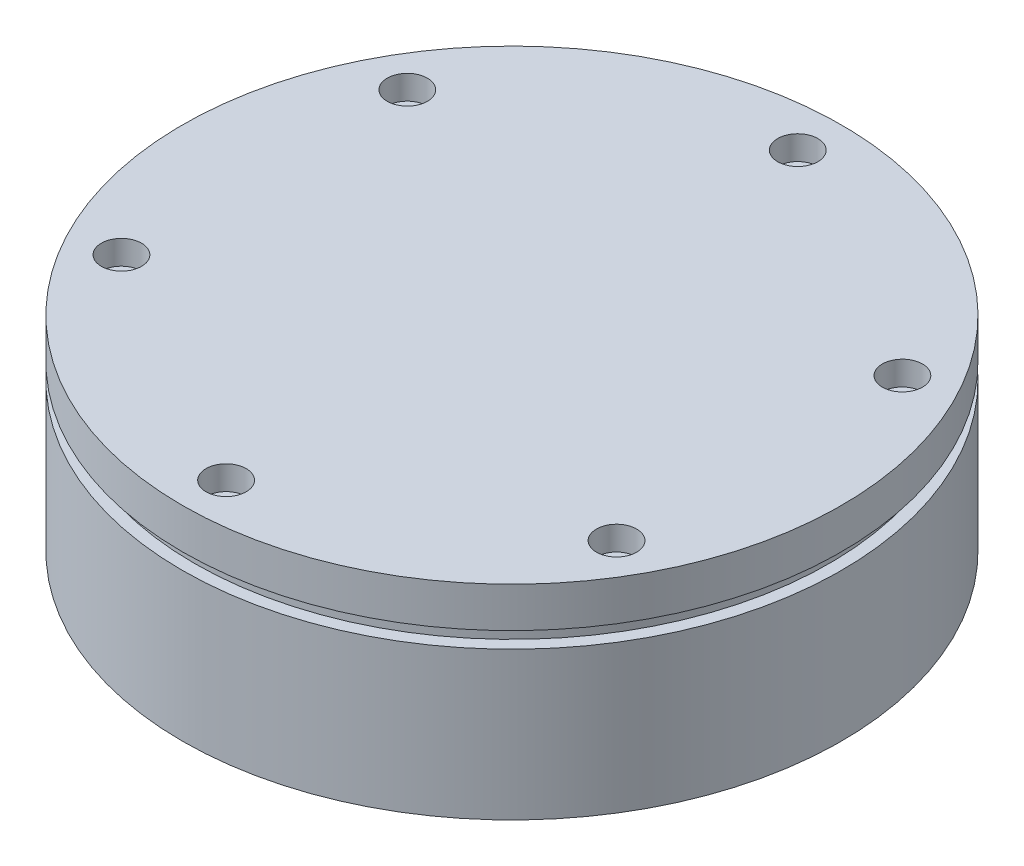
ISO-10303-21;
HEADER;
FILE_DESCRIPTION(('STEP AP214'),'2;1');
FILE_NAME('part.step','',(''),(''),'','','');
FILE_SCHEMA(('AUTOMOTIVE_DESIGN { 1 0 10303 214 1 1 1 1 }'));
ENDSEC;
DATA;
#1=APPLICATION_CONTEXT('core data for automotive mechanical design processes');
#2=APPLICATION_PROTOCOL_DEFINITION('international standard','automotive_design',2000,#1);
#3=PRODUCT_CONTEXT('',#1,'mechanical');
#4=PRODUCT('Part','Part','',(#3));
#5=PRODUCT_RELATED_PRODUCT_CATEGORY('part','',(#4));
#6=PRODUCT_DEFINITION_FORMATION('','',#4);
#7=PRODUCT_DEFINITION_CONTEXT('part definition',#1,'design');
#8=PRODUCT_DEFINITION('design','',#6,#7);
#9=PRODUCT_DEFINITION_SHAPE('','',#8);
#10=(LENGTH_UNIT() NAMED_UNIT(*) SI_UNIT(.MILLI.,.METRE.));
#11=(NAMED_UNIT(*) PLANE_ANGLE_UNIT() SI_UNIT($,.RADIAN.));
#12=(NAMED_UNIT(*) SI_UNIT($,.STERADIAN.) SOLID_ANGLE_UNIT());
#13=UNCERTAINTY_MEASURE_WITH_UNIT(LENGTH_MEASURE(1.E-05),#10,'distance_accuracy_value','');
#14=(GEOMETRIC_REPRESENTATION_CONTEXT(3) GLOBAL_UNCERTAINTY_ASSIGNED_CONTEXT((#13)) GLOBAL_UNIT_ASSIGNED_CONTEXT((#10,
#11,#12)) REPRESENTATION_CONTEXT('',''));
#15=CARTESIAN_POINT('',(0.,0.,0.));
#16=DIRECTION('',(0.,0.,1.));
#17=DIRECTION('',(1.,0.,0.));
#18=AXIS2_PLACEMENT_3D('',#15,#16,#17);
#19=CARTESIAN_POINT('',(0.,18.4,0.));
#20=DIRECTION('',(0.,-1.,0.));
#21=DIRECTION('',(0.,0.,-1.));
#22=AXIS2_PLACEMENT_3D('',#19,#20,#21);
#23=CYLINDRICAL_SURFACE('',#22,41.);
#24=CARTESIAN_POINT('',(0.,18.4,0.));
#25=DIRECTION('',(0.,1.,0.));
#26=DIRECTION('',(0.,0.,1.));
#27=AXIS2_PLACEMENT_3D('',#24,#25,#26);
#28=CIRCLE('',#27,41.);
#29=CARTESIAN_POINT('',(0.,18.4,41.));
#30=VERTEX_POINT('',#29);
#31=EDGE_CURVE('E40',#30,#30,#28,.T.);
#32=ORIENTED_EDGE('',*,*,#31,.F.);
#33=EDGE_LOOP('',(#32));
#34=FACE_BOUND('',#33,.T.);
#35=CARTESIAN_POINT('',(0.,0.,0.));
#36=DIRECTION('',(0.,1.,0.));
#37=DIRECTION('',(0.,0.,1.));
#38=AXIS2_PLACEMENT_3D('',#35,#36,#37);
#39=CIRCLE('',#38,41.);
#40=CARTESIAN_POINT('',(0.,0.,41.));
#41=VERTEX_POINT('',#40);
#42=EDGE_CURVE('E36',#41,#41,#39,.T.);
#43=ORIENTED_EDGE('',*,*,#42,.T.);
#44=EDGE_LOOP('',(#43));
#45=FACE_BOUND('',#44,.T.);
#46=ADVANCED_FACE('F33',(#34,#45),#23,.T.);
#47=CARTESIAN_POINT('',(0.,18.4,0.));
#48=DIRECTION('',(0.,1.,0.));
#49=DIRECTION('',(0.,0.,1.));
#50=AXIS2_PLACEMENT_3D('',#47,#48,#49);
#51=PLANE('',#50);
#52=CARTESIAN_POINT('',(0.,18.4,0.));
#53=DIRECTION('',(0.,1.,0.));
#54=DIRECTION('',(0.,0.,1.));
#55=AXIS2_PLACEMENT_3D('',#52,#53,#54);
#56=CIRCLE('',#55,39.5);
#57=CARTESIAN_POINT('',(0.,18.4,39.5));
#58=VERTEX_POINT('',#57);
#59=EDGE_CURVE('E10',#58,#58,#56,.T.);
#60=ORIENTED_EDGE('',*,*,#59,.F.);
#61=EDGE_LOOP('',(#60));
#62=FACE_BOUND('',#61,.T.);
#63=ORIENTED_EDGE('',*,*,#31,.T.);
#64=EDGE_LOOP('',(#63));
#65=FACE_BOUND('',#64,.T.);
#66=ADVANCED_FACE('F165',(#62,#65),#51,.T.);
#67=CARTESIAN_POINT('',(0.,0.,0.));
#68=DIRECTION('',(0.,1.,0.));
#69=DIRECTION('',(0.,0.,1.));
#70=AXIS2_PLACEMENT_3D('',#67,#68,#69);
#71=PLANE('',#70);
#72=CARTESIAN_POINT('',(-1.30887712196749E-12,0.,35.5599999999974));
#73=DIRECTION('',(0.,-1.,0.));
#74=DIRECTION('',(0.,0.,-1.));
#75=AXIS2_PLACEMENT_3D('',#72,#73,#74);
#76=CIRCLE('',#75,2.5);
#77=CARTESIAN_POINT('',(-1.30887712196749E-12,0.,33.0599999999974));
#78=VERTEX_POINT('',#77);
#79=EDGE_CURVE('E62',#78,#78,#76,.T.);
#80=ORIENTED_EDGE('',*,*,#79,.F.);
#81=EDGE_LOOP('',(#80));
#82=FACE_BOUND('',#81,.T.);
#83=CARTESIAN_POINT('',(-30.7958633585746,0.,17.779999999995));
#84=DIRECTION('',(0.,-1.,0.));
#85=DIRECTION('',(0.,0.,-1.));
#86=AXIS2_PLACEMENT_3D('',#83,#84,#85);
#87=CIRCLE('',#86,2.5);
#88=CARTESIAN_POINT('',(-30.7958633585746,0.,15.279999999995));
#89=VERTEX_POINT('',#88);
#90=EDGE_CURVE('E69',#89,#89,#87,.T.);
#91=ORIENTED_EDGE('',*,*,#90,.F.);
#92=EDGE_LOOP('',(#91));
#93=FACE_BOUND('',#92,.T.);
#94=CARTESIAN_POINT('',(-30.7958633585718,0.,-17.780000000005));
#95=DIRECTION('',(0.,-1.,0.));
#96=DIRECTION('',(0.,0.,-1.));
#97=AXIS2_PLACEMENT_3D('',#94,#95,#96);
#98=CIRCLE('',#97,2.5);
#99=CARTESIAN_POINT('',(-30.7958633585718,0.,-20.280000000005));
#100=VERTEX_POINT('',#99);
#101=EDGE_CURVE('E75',#100,#100,#98,.T.);
#102=ORIENTED_EDGE('',*,*,#101,.F.);
#103=EDGE_LOOP('',(#102));
#104=FACE_BOUND('',#103,.T.);
#105=CARTESIAN_POINT('',(4.26137647808002E-12,0.,-35.5600000000026));
#106=DIRECTION('',(0.,-1.,0.));
#107=DIRECTION('',(0.,0.,-1.));
#108=AXIS2_PLACEMENT_3D('',#105,#106,#107);
#109=CIRCLE('',#108,2.5);
#110=CARTESIAN_POINT('',(4.26137647808002E-12,0.,-38.0600000000026));
#111=VERTEX_POINT('',#110);
#112=EDGE_CURVE('E81',#111,#111,#109,.T.);
#113=ORIENTED_EDGE('',*,*,#112,.F.);
#114=EDGE_LOOP('',(#113));
#115=FACE_BOUND('',#114,.T.);
#116=CARTESIAN_POINT('',(30.7958633585775,0.,-17.7800000000002));
#117=DIRECTION('',(0.,-1.,0.));
#118=DIRECTION('',(0.,0.,-1.));
#119=AXIS2_PLACEMENT_3D('',#116,#117,#118);
#120=CIRCLE('',#119,2.5);
#121=CARTESIAN_POINT('',(30.7958633585775,0.,-20.2800000000002));
#122=VERTEX_POINT('',#121);
#123=EDGE_CURVE('E87',#122,#122,#120,.T.);
#124=ORIENTED_EDGE('',*,*,#123,.F.);
#125=EDGE_LOOP('',(#124));
#126=FACE_BOUND('',#125,.T.);
#127=CARTESIAN_POINT('',(30.7958633585747,0.,17.7799999999998));
#128=DIRECTION('',(0.,-1.,0.));
#129=DIRECTION('',(0.,0.,-1.));
#130=AXIS2_PLACEMENT_3D('',#127,#128,#129);
#131=CIRCLE('',#130,2.5);
#132=CARTESIAN_POINT('',(30.7958633585747,0.,15.2799999999998));
#133=VERTEX_POINT('',#132);
#134=EDGE_CURVE('E56',#133,#133,#131,.T.);
#135=ORIENTED_EDGE('',*,*,#134,.F.);
#136=EDGE_LOOP('',(#135));
#137=FACE_BOUND('',#136,.T.);
#138=ORIENTED_EDGE('',*,*,#42,.F.);
#139=EDGE_LOOP('',(#138));
#140=FACE_BOUND('',#139,.T.);
#141=ADVANCED_FACE('F170',(#82,#93,#104,#115,#126,#137,#140),#71,.F.);
#142=CARTESIAN_POINT('',(0.,20.4,0.));
#143=DIRECTION('',(0.,-1.,0.));
#144=DIRECTION('',(0.,0.,-1.));
#145=AXIS2_PLACEMENT_3D('',#142,#143,#144);
#146=CYLINDRICAL_SURFACE('',#145,39.5);
#147=CARTESIAN_POINT('',(0.,20.4,0.));
#148=DIRECTION('',(0.,1.,0.));
#149=DIRECTION('',(0.,0.,1.));
#150=AXIS2_PLACEMENT_3D('',#147,#148,#149);
#151=CIRCLE('',#150,39.5);
#152=CARTESIAN_POINT('',(0.,20.4,39.5));
#153=VERTEX_POINT('',#152);
#154=EDGE_CURVE('E46',#153,#153,#151,.T.);
#155=ORIENTED_EDGE('',*,*,#154,.F.);
#156=EDGE_LOOP('',(#155));
#157=FACE_BOUND('',#156,.T.);
#158=ORIENTED_EDGE('',*,*,#59,.T.);
#159=EDGE_LOOP('',(#158));
#160=FACE_BOUND('',#159,.T.);
#161=ADVANCED_FACE('F150',(#157,#160),#146,.T.);
#162=CARTESIAN_POINT('',(0.,25.4,0.));
#163=DIRECTION('',(0.,-1.,0.));
#164=DIRECTION('',(0.,0.,-1.));
#165=AXIS2_PLACEMENT_3D('',#162,#163,#164);
#166=CYLINDRICAL_SURFACE('',#165,41.);
#167=CARTESIAN_POINT('',(0.,25.4,0.));
#168=DIRECTION('',(0.,1.,0.));
#169=DIRECTION('',(0.,0.,1.));
#170=AXIS2_PLACEMENT_3D('',#167,#168,#169);
#171=CIRCLE('',#170,41.);
#172=CARTESIAN_POINT('',(0.,25.4,41.));
#173=VERTEX_POINT('',#172);
#174=EDGE_CURVE('E49',#173,#173,#171,.T.);
#175=ORIENTED_EDGE('',*,*,#174,.F.);
#176=EDGE_LOOP('',(#175));
#177=FACE_BOUND('',#176,.T.);
#178=CARTESIAN_POINT('',(0.,20.4,0.));
#179=DIRECTION('',(0.,1.,0.));
#180=DIRECTION('',(0.,0.,1.));
#181=AXIS2_PLACEMENT_3D('',#178,#179,#180);
#182=CIRCLE('',#181,41.);
#183=CARTESIAN_POINT('',(0.,20.4,41.));
#184=VERTEX_POINT('',#183);
#185=EDGE_CURVE('E50',#184,#184,#182,.T.);
#186=ORIENTED_EDGE('',*,*,#185,.T.);
#187=EDGE_LOOP('',(#186));
#188=FACE_BOUND('',#187,.T.);
#189=ADVANCED_FACE('F141',(#177,#188),#166,.T.);
#190=CARTESIAN_POINT('',(0.,25.4,0.));
#191=DIRECTION('',(0.,1.,0.));
#192=DIRECTION('',(0.,0.,1.));
#193=AXIS2_PLACEMENT_3D('',#190,#191,#192);
#194=PLANE('',#193);
#195=CARTESIAN_POINT('',(-8.17803796453492E-13,25.4,-35.5599999999983));
#196=DIRECTION('',(0.,1.,0.));
#197=DIRECTION('',(0.,0.,1.));
#198=AXIS2_PLACEMENT_3D('',#195,#196,#197);
#199=CIRCLE('',#198,2.50000000000202);
#200=CARTESIAN_POINT('',(-8.17803796453492E-13,25.4,-33.0599999999963));
#201=VERTEX_POINT('',#200);
#202=EDGE_CURVE('E98',#201,#201,#199,.T.);
#203=ORIENTED_EDGE('',*,*,#202,.F.);
#204=EDGE_LOOP('',(#203));
#205=FACE_BOUND('',#204,.T.);
#206=CARTESIAN_POINT('',(-30.7958633585745,25.4,-17.7799999999967));
#207=DIRECTION('',(0.,1.,0.));
#208=DIRECTION('',(0.,0.,1.));
#209=AXIS2_PLACEMENT_3D('',#206,#207,#208);
#210=CIRCLE('',#209,2.50000000000244);
#211=CARTESIAN_POINT('',(-30.7958633585745,25.4,-15.2799999999943));
#212=VERTEX_POINT('',#211);
#213=EDGE_CURVE('E104',#212,#212,#210,.T.);
#214=ORIENTED_EDGE('',*,*,#213,.F.);
#215=EDGE_LOOP('',(#214));
#216=FACE_BOUND('',#215,.T.);
#217=CARTESIAN_POINT('',(-30.7958633585727,25.4,17.7800000000033));
#218=DIRECTION('',(0.,1.,0.));
#219=DIRECTION('',(0.,0.,1.));
#220=AXIS2_PLACEMENT_3D('',#217,#218,#219);
#221=CIRCLE('',#220,2.50000000000096);
#222=CARTESIAN_POINT('',(-30.7958633585727,25.4,20.2800000000042));
#223=VERTEX_POINT('',#222);
#224=EDGE_CURVE('E110',#223,#223,#221,.T.);
#225=ORIENTED_EDGE('',*,*,#224,.F.);
#226=EDGE_LOOP('',(#225));
#227=FACE_BOUND('',#226,.T.);
#228=CARTESIAN_POINT('',(2.7919191121151E-12,25.4,35.5600000000017));
#229=DIRECTION('',(0.,1.,0.));
#230=DIRECTION('',(0.,0.,1.));
#231=AXIS2_PLACEMENT_3D('',#228,#229,#230);
#232=CIRCLE('',#231,2.49999999999904);
#233=CARTESIAN_POINT('',(2.7919191121151E-12,25.4,38.0600000000008));
#234=VERTEX_POINT('',#233);
#235=EDGE_CURVE('E116',#234,#234,#232,.T.);
#236=ORIENTED_EDGE('',*,*,#235,.F.);
#237=EDGE_LOOP('',(#236));
#238=FACE_BOUND('',#237,.T.);
#239=CARTESIAN_POINT('',(30.7958633585765,25.4,17.7800000000002));
#240=DIRECTION('',(0.,1.,0.));
#241=DIRECTION('',(0.,0.,1.));
#242=AXIS2_PLACEMENT_3D('',#239,#240,#241);
#243=CIRCLE('',#242,2.49999999999857);
#244=CARTESIAN_POINT('',(30.7958633585765,25.4,20.2799999999987));
#245=VERTEX_POINT('',#244);
#246=EDGE_CURVE('E122',#245,#245,#243,.T.);
#247=ORIENTED_EDGE('',*,*,#246,.F.);
#248=EDGE_LOOP('',(#247));
#249=FACE_BOUND('',#248,.T.);
#250=CARTESIAN_POINT('',(30.7958633585747,25.4,-17.7799999999998));
#251=DIRECTION('',(0.,1.,0.));
#252=DIRECTION('',(0.,0.,1.));
#253=AXIS2_PLACEMENT_3D('',#250,#251,#252);
#254=CIRCLE('',#253,2.50000000000001);
#255=CARTESIAN_POINT('',(30.7958633585747,25.4,-15.2799999999998));
#256=VERTEX_POINT('',#255);
#257=EDGE_CURVE('E92',#256,#256,#254,.T.);
#258=ORIENTED_EDGE('',*,*,#257,.F.);
#259=EDGE_LOOP('',(#258));
#260=FACE_BOUND('',#259,.T.);
#261=ORIENTED_EDGE('',*,*,#174,.T.);
#262=EDGE_LOOP('',(#261));
#263=FACE_BOUND('',#262,.T.);
#264=ADVANCED_FACE('F137',(#205,#216,#227,#238,#249,#260,#263),#194,.T.);
#265=CARTESIAN_POINT('',(0.,20.4,0.));
#266=DIRECTION('',(0.,1.,0.));
#267=DIRECTION('',(0.,0.,1.));
#268=AXIS2_PLACEMENT_3D('',#265,#266,#267);
#269=PLANE('',#268);
#270=ORIENTED_EDGE('',*,*,#154,.T.);
#271=EDGE_LOOP('',(#270));
#272=FACE_BOUND('',#271,.T.);
#273=ORIENTED_EDGE('',*,*,#185,.F.);
#274=EDGE_LOOP('',(#273));
#275=FACE_BOUND('',#274,.T.);
#276=ADVANCED_FACE('F140',(#272,#275),#269,.F.);
#277=CARTESIAN_POINT('',(30.7958633585747,5.,17.7799999999998));
#278=DIRECTION('',(0.,-1.,0.));
#279=DIRECTION('',(0.,0.,-1.));
#280=AXIS2_PLACEMENT_3D('',#277,#278,#279);
#281=CYLINDRICAL_SURFACE('',#280,2.5);
#282=CARTESIAN_POINT('',(30.7958633585747,5.,17.7799999999998));
#283=DIRECTION('',(0.,-1.,0.));
#284=DIRECTION('',(0.,0.,-1.));
#285=AXIS2_PLACEMENT_3D('',#282,#283,#284);
#286=CIRCLE('',#285,2.5);
#287=CARTESIAN_POINT('',(30.7958633585747,5.,15.2799999999998));
#288=VERTEX_POINT('',#287);
#289=EDGE_CURVE('E53',#288,#288,#286,.T.);
#290=ORIENTED_EDGE('',*,*,#289,.F.);
#291=EDGE_LOOP('',(#290));
#292=FACE_BOUND('',#291,.T.);
#293=ORIENTED_EDGE('',*,*,#134,.T.);
#294=EDGE_LOOP('',(#293));
#295=FACE_BOUND('',#294,.T.);
#296=ADVANCED_FACE('F155',(#292,#295),#281,.F.);
#297=CARTESIAN_POINT('',(30.7958633585747,5.,17.7799999999998));
#298=DIRECTION('',(0.,-1.,0.));
#299=DIRECTION('',(0.,0.,-1.));
#300=AXIS2_PLACEMENT_3D('',#297,#298,#299);
#301=PLANE('',#300);
#302=ORIENTED_EDGE('',*,*,#289,.T.);
#303=EDGE_LOOP('',(#302));
#304=FACE_BOUND('',#303,.T.);
#305=ADVANCED_FACE('F161',(#304),#301,.T.);
#306=CARTESIAN_POINT('',(30.7958633585775,5.,-17.7800000000002));
#307=DIRECTION('',(0.,-1.,0.));
#308=DIRECTION('',(0.,0.,-1.));
#309=AXIS2_PLACEMENT_3D('',#306,#307,#308);
#310=CYLINDRICAL_SURFACE('',#309,2.5);
#311=CARTESIAN_POINT('',(30.7958633585775,5.,-17.7800000000002));
#312=DIRECTION('',(0.,-1.,0.));
#313=DIRECTION('',(0.,0.,-1.));
#314=AXIS2_PLACEMENT_3D('',#311,#312,#313);
#315=CIRCLE('',#314,2.5);
#316=CARTESIAN_POINT('',(30.7958633585775,5.,-20.2800000000002));
#317=VERTEX_POINT('',#316);
#318=EDGE_CURVE('E59',#317,#317,#315,.T.);
#319=ORIENTED_EDGE('',*,*,#318,.F.);
#320=EDGE_LOOP('',(#319));
#321=FACE_BOUND('',#320,.T.);
#322=ORIENTED_EDGE('',*,*,#123,.T.);
#323=EDGE_LOOP('',(#322));
#324=FACE_BOUND('',#323,.T.);
#325=ADVANCED_FACE('F198',(#321,#324),#310,.F.);
#326=CARTESIAN_POINT('',(30.7958633585775,5.,-17.7800000000002));
#327=DIRECTION('',(0.,-1.,0.));
#328=DIRECTION('',(0.,0.,-1.));
#329=AXIS2_PLACEMENT_3D('',#326,#327,#328);
#330=PLANE('',#329);
#331=ORIENTED_EDGE('',*,*,#318,.T.);
#332=EDGE_LOOP('',(#331));
#333=FACE_BOUND('',#332,.T.);
#334=ADVANCED_FACE('F200',(#333),#330,.T.);
#335=CARTESIAN_POINT('',(4.26137647808002E-12,5.,-35.5600000000026));
#336=DIRECTION('',(0.,-1.,0.));
#337=DIRECTION('',(0.,0.,-1.));
#338=AXIS2_PLACEMENT_3D('',#335,#336,#337);
#339=CYLINDRICAL_SURFACE('',#338,2.5);
#340=CARTESIAN_POINT('',(4.26137647808002E-12,5.,-35.5600000000026));
#341=DIRECTION('',(0.,-1.,0.));
#342=DIRECTION('',(0.,0.,-1.));
#343=AXIS2_PLACEMENT_3D('',#340,#341,#342);
#344=CIRCLE('',#343,2.5);
#345=CARTESIAN_POINT('',(4.26137647808002E-12,5.,-38.0600000000026));
#346=VERTEX_POINT('',#345);
#347=EDGE_CURVE('E84',#346,#346,#344,.T.);
#348=ORIENTED_EDGE('',*,*,#347,.F.);
#349=EDGE_LOOP('',(#348));
#350=FACE_BOUND('',#349,.T.);
#351=ORIENTED_EDGE('',*,*,#112,.T.);
#352=EDGE_LOOP('',(#351));
#353=FACE_BOUND('',#352,.T.);
#354=ADVANCED_FACE('F207',(#350,#353),#339,.F.);
#355=CARTESIAN_POINT('',(4.26137647808002E-12,5.,-35.5600000000026));
#356=DIRECTION('',(0.,-1.,0.));
#357=DIRECTION('',(0.,0.,-1.));
#358=AXIS2_PLACEMENT_3D('',#355,#356,#357);
#359=PLANE('',#358);
#360=ORIENTED_EDGE('',*,*,#347,.T.);
#361=EDGE_LOOP('',(#360));
#362=FACE_BOUND('',#361,.T.);
#363=ADVANCED_FACE('F215',(#362),#359,.T.);
#364=CARTESIAN_POINT('',(-30.7958633585718,5.,-17.780000000005));
#365=DIRECTION('',(0.,-1.,0.));
#366=DIRECTION('',(0.,0.,-1.));
#367=AXIS2_PLACEMENT_3D('',#364,#365,#366);
#368=CYLINDRICAL_SURFACE('',#367,2.5);
#369=CARTESIAN_POINT('',(-30.7958633585718,5.,-17.780000000005));
#370=DIRECTION('',(0.,-1.,0.));
#371=DIRECTION('',(0.,0.,-1.));
#372=AXIS2_PLACEMENT_3D('',#369,#370,#371);
#373=CIRCLE('',#372,2.5);
#374=CARTESIAN_POINT('',(-30.7958633585718,5.,-20.280000000005));
#375=VERTEX_POINT('',#374);
#376=EDGE_CURVE('E78',#375,#375,#373,.T.);
#377=ORIENTED_EDGE('',*,*,#376,.F.);
#378=EDGE_LOOP('',(#377));
#379=FACE_BOUND('',#378,.T.);
#380=ORIENTED_EDGE('',*,*,#101,.T.);
#381=EDGE_LOOP('',(#380));
#382=FACE_BOUND('',#381,.T.);
#383=ADVANCED_FACE('F218',(#379,#382),#368,.F.);
#384=CARTESIAN_POINT('',(-30.7958633585718,5.,-17.780000000005));
#385=DIRECTION('',(0.,-1.,0.));
#386=DIRECTION('',(0.,0.,-1.));
#387=AXIS2_PLACEMENT_3D('',#384,#385,#386);
#388=PLANE('',#387);
#389=ORIENTED_EDGE('',*,*,#376,.T.);
#390=EDGE_LOOP('',(#389));
#391=FACE_BOUND('',#390,.T.);
#392=ADVANCED_FACE('F223',(#391),#388,.T.);
#393=CARTESIAN_POINT('',(-30.7958633585746,5.,17.779999999995));
#394=DIRECTION('',(0.,-1.,0.));
#395=DIRECTION('',(0.,0.,-1.));
#396=AXIS2_PLACEMENT_3D('',#393,#394,#395);
#397=CYLINDRICAL_SURFACE('',#396,2.5);
#398=CARTESIAN_POINT('',(-30.7958633585746,5.,17.779999999995));
#399=DIRECTION('',(0.,-1.,0.));
#400=DIRECTION('',(0.,0.,-1.));
#401=AXIS2_PLACEMENT_3D('',#398,#399,#400);
#402=CIRCLE('',#401,2.5);
#403=CARTESIAN_POINT('',(-30.7958633585746,5.,15.279999999995));
#404=VERTEX_POINT('',#403);
#405=EDGE_CURVE('E72',#404,#404,#402,.T.);
#406=ORIENTED_EDGE('',*,*,#405,.F.);
#407=EDGE_LOOP('',(#406));
#408=FACE_BOUND('',#407,.T.);
#409=ORIENTED_EDGE('',*,*,#90,.T.);
#410=EDGE_LOOP('',(#409));
#411=FACE_BOUND('',#410,.T.);
#412=ADVANCED_FACE('F226',(#408,#411),#397,.F.);
#413=CARTESIAN_POINT('',(-30.7958633585746,5.,17.779999999995));
#414=DIRECTION('',(0.,-1.,0.));
#415=DIRECTION('',(0.,0.,-1.));
#416=AXIS2_PLACEMENT_3D('',#413,#414,#415);
#417=PLANE('',#416);
#418=ORIENTED_EDGE('',*,*,#405,.T.);
#419=EDGE_LOOP('',(#418));
#420=FACE_BOUND('',#419,.T.);
#421=ADVANCED_FACE('F231',(#420),#417,.T.);
#422=CARTESIAN_POINT('',(-1.30887712196749E-12,5.,35.5599999999974));
#423=DIRECTION('',(0.,-1.,0.));
#424=DIRECTION('',(0.,0.,-1.));
#425=AXIS2_PLACEMENT_3D('',#422,#423,#424);
#426=CYLINDRICAL_SURFACE('',#425,2.5);
#427=CARTESIAN_POINT('',(-1.30887712196749E-12,5.,35.5599999999974));
#428=DIRECTION('',(0.,-1.,0.));
#429=DIRECTION('',(0.,0.,-1.));
#430=AXIS2_PLACEMENT_3D('',#427,#428,#429);
#431=CIRCLE('',#430,2.5);
#432=CARTESIAN_POINT('',(-1.30887712196749E-12,5.,33.0599999999974));
#433=VERTEX_POINT('',#432);
#434=EDGE_CURVE('E65',#433,#433,#431,.T.);
#435=ORIENTED_EDGE('',*,*,#434,.F.);
#436=EDGE_LOOP('',(#435));
#437=FACE_BOUND('',#436,.T.);
#438=ORIENTED_EDGE('',*,*,#79,.T.);
#439=EDGE_LOOP('',(#438));
#440=FACE_BOUND('',#439,.T.);
#441=ADVANCED_FACE('F234',(#437,#440),#426,.F.);
#442=CARTESIAN_POINT('',(-1.30887712196749E-12,5.,35.5599999999974));
#443=DIRECTION('',(0.,-1.,0.));
#444=DIRECTION('',(0.,0.,-1.));
#445=AXIS2_PLACEMENT_3D('',#442,#443,#444);
#446=PLANE('',#445);
#447=ORIENTED_EDGE('',*,*,#434,.T.);
#448=EDGE_LOOP('',(#447));
#449=FACE_BOUND('',#448,.T.);
#450=ADVANCED_FACE('F239',(#449),#446,.T.);
#451=CARTESIAN_POINT('',(30.7958633585747,22.4,-17.7799999999998));
#452=DIRECTION('',(0.,1.,0.));
#453=DIRECTION('',(0.,0.,1.));
#454=AXIS2_PLACEMENT_3D('',#451,#452,#453);
#455=CYLINDRICAL_SURFACE('',#454,2.50000000000001);
#456=CARTESIAN_POINT('',(30.7958633585747,22.4,-17.7799999999998));
#457=DIRECTION('',(0.,1.,0.));
#458=DIRECTION('',(0.,0.,1.));
#459=AXIS2_PLACEMENT_3D('',#456,#457,#458);
#460=CIRCLE('',#459,2.50000000000001);
#461=CARTESIAN_POINT('',(30.7958633585747,22.4,-15.2799999999998));
#462=VERTEX_POINT('',#461);
#463=EDGE_CURVE('E66',#462,#462,#460,.T.);
#464=ORIENTED_EDGE('',*,*,#463,.F.);
#465=EDGE_LOOP('',(#464));
#466=FACE_BOUND('',#465,.T.);
#467=ORIENTED_EDGE('',*,*,#257,.T.);
#468=EDGE_LOOP('',(#467));
#469=FACE_BOUND('',#468,.T.);
#470=ADVANCED_FACE('F242',(#466,#469),#455,.F.);
#471=CARTESIAN_POINT('',(30.7958633585747,22.4,-17.7799999999998));
#472=DIRECTION('',(0.,1.,0.));
#473=DIRECTION('',(0.,0.,1.));
#474=AXIS2_PLACEMENT_3D('',#471,#472,#473);
#475=PLANE('',#474);
#476=ORIENTED_EDGE('',*,*,#463,.T.);
#477=EDGE_LOOP('',(#476));
#478=FACE_BOUND('',#477,.T.);
#479=ADVANCED_FACE('F133',(#478),#475,.T.);
#480=CARTESIAN_POINT('',(30.7958633585765,22.4,17.7800000000002));
#481=DIRECTION('',(0.,1.,0.));
#482=DIRECTION('',(0.,0.,1.));
#483=AXIS2_PLACEMENT_3D('',#480,#481,#482);
#484=CYLINDRICAL_SURFACE('',#483,2.49999999999857);
#485=CARTESIAN_POINT('',(30.7958633585765,22.4,17.7800000000002));
#486=DIRECTION('',(0.,1.,0.));
#487=DIRECTION('',(0.,0.,1.));
#488=AXIS2_PLACEMENT_3D('',#485,#486,#487);
#489=CIRCLE('',#488,2.49999999999857);
#490=CARTESIAN_POINT('',(30.7958633585765,22.4,20.2799999999987));
#491=VERTEX_POINT('',#490);
#492=EDGE_CURVE('E95',#491,#491,#489,.T.);
#493=ORIENTED_EDGE('',*,*,#492,.F.);
#494=EDGE_LOOP('',(#493));
#495=FACE_BOUND('',#494,.T.);
#496=ORIENTED_EDGE('',*,*,#246,.T.);
#497=EDGE_LOOP('',(#496));
#498=FACE_BOUND('',#497,.T.);
#499=ADVANCED_FACE('F130',(#495,#498),#484,.F.);
#500=CARTESIAN_POINT('',(30.7958633585765,22.4,17.7800000000002));
#501=DIRECTION('',(0.,1.,0.));
#502=DIRECTION('',(0.,0.,1.));
#503=AXIS2_PLACEMENT_3D('',#500,#501,#502);
#504=PLANE('',#503);
#505=ORIENTED_EDGE('',*,*,#492,.T.);
#506=EDGE_LOOP('',(#505));
#507=FACE_BOUND('',#506,.T.);
#508=ADVANCED_FACE('F128',(#507),#504,.T.);
#509=CARTESIAN_POINT('',(2.7919191121151E-12,22.4,35.5600000000017));
#510=DIRECTION('',(0.,1.,0.));
#511=DIRECTION('',(0.,0.,1.));
#512=AXIS2_PLACEMENT_3D('',#509,#510,#511);
#513=CYLINDRICAL_SURFACE('',#512,2.49999999999904);
#514=CARTESIAN_POINT('',(2.7919191121151E-12,22.4,35.5600000000017));
#515=DIRECTION('',(0.,1.,0.));
#516=DIRECTION('',(0.,0.,1.));
#517=AXIS2_PLACEMENT_3D('',#514,#515,#516);
#518=CIRCLE('',#517,2.49999999999904);
#519=CARTESIAN_POINT('',(2.7919191121151E-12,22.4,38.0600000000008));
#520=VERTEX_POINT('',#519);
#521=EDGE_CURVE('E119',#520,#520,#518,.T.);
#522=ORIENTED_EDGE('',*,*,#521,.F.);
#523=EDGE_LOOP('',(#522));
#524=FACE_BOUND('',#523,.T.);
#525=ORIENTED_EDGE('',*,*,#235,.T.);
#526=EDGE_LOOP('',(#525));
#527=FACE_BOUND('',#526,.T.);
#528=ADVANCED_FACE('F280',(#524,#527),#513,.F.);
#529=CARTESIAN_POINT('',(2.7919191121151E-12,22.4,35.5600000000017));
#530=DIRECTION('',(0.,1.,0.));
#531=DIRECTION('',(0.,0.,1.));
#532=AXIS2_PLACEMENT_3D('',#529,#530,#531);
#533=PLANE('',#532);
#534=ORIENTED_EDGE('',*,*,#521,.T.);
#535=EDGE_LOOP('',(#534));
#536=FACE_BOUND('',#535,.T.);
#537=ADVANCED_FACE('F287',(#536),#533,.T.);
#538=CARTESIAN_POINT('',(-30.7958633585727,22.4,17.7800000000033));
#539=DIRECTION('',(0.,1.,0.));
#540=DIRECTION('',(0.,0.,1.));
#541=AXIS2_PLACEMENT_3D('',#538,#539,#540);
#542=CYLINDRICAL_SURFACE('',#541,2.50000000000096);
#543=CARTESIAN_POINT('',(-30.7958633585727,22.4,17.7800000000033));
#544=DIRECTION('',(0.,1.,0.));
#545=DIRECTION('',(0.,0.,1.));
#546=AXIS2_PLACEMENT_3D('',#543,#544,#545);
#547=CIRCLE('',#546,2.50000000000096);
#548=CARTESIAN_POINT('',(-30.7958633585727,22.4,20.2800000000042));
#549=VERTEX_POINT('',#548);
#550=EDGE_CURVE('E113',#549,#549,#547,.T.);
#551=ORIENTED_EDGE('',*,*,#550,.F.);
#552=EDGE_LOOP('',(#551));
#553=FACE_BOUND('',#552,.T.);
#554=ORIENTED_EDGE('',*,*,#224,.T.);
#555=EDGE_LOOP('',(#554));
#556=FACE_BOUND('',#555,.T.);
#557=ADVANCED_FACE('F295',(#553,#556),#542,.F.);
#558=CARTESIAN_POINT('',(-30.7958633585727,22.4,17.7800000000033));
#559=DIRECTION('',(0.,1.,0.));
#560=DIRECTION('',(0.,0.,1.));
#561=AXIS2_PLACEMENT_3D('',#558,#559,#560);
#562=PLANE('',#561);
#563=ORIENTED_EDGE('',*,*,#550,.T.);
#564=EDGE_LOOP('',(#563));
#565=FACE_BOUND('',#564,.T.);
#566=ADVANCED_FACE('F303',(#565),#562,.T.);
#567=CARTESIAN_POINT('',(-30.7958633585745,22.4,-17.7799999999967));
#568=DIRECTION('',(0.,1.,0.));
#569=DIRECTION('',(0.,0.,1.));
#570=AXIS2_PLACEMENT_3D('',#567,#568,#569);
#571=CYLINDRICAL_SURFACE('',#570,2.50000000000244);
#572=CARTESIAN_POINT('',(-30.7958633585745,22.4,-17.7799999999967));
#573=DIRECTION('',(0.,1.,0.));
#574=DIRECTION('',(0.,0.,1.));
#575=AXIS2_PLACEMENT_3D('',#572,#573,#574);
#576=CIRCLE('',#575,2.50000000000244);
#577=CARTESIAN_POINT('',(-30.7958633585745,22.4,-15.2799999999943));
#578=VERTEX_POINT('',#577);
#579=EDGE_CURVE('E107',#578,#578,#576,.T.);
#580=ORIENTED_EDGE('',*,*,#579,.F.);
#581=EDGE_LOOP('',(#580));
#582=FACE_BOUND('',#581,.T.);
#583=ORIENTED_EDGE('',*,*,#213,.T.);
#584=EDGE_LOOP('',(#583));
#585=FACE_BOUND('',#584,.T.);
#586=ADVANCED_FACE('F311',(#582,#585),#571,.F.);
#587=CARTESIAN_POINT('',(-30.7958633585745,22.4,-17.7799999999967));
#588=DIRECTION('',(0.,1.,0.));
#589=DIRECTION('',(0.,0.,1.));
#590=AXIS2_PLACEMENT_3D('',#587,#588,#589);
#591=PLANE('',#590);
#592=ORIENTED_EDGE('',*,*,#579,.T.);
#593=EDGE_LOOP('',(#592));
#594=FACE_BOUND('',#593,.T.);
#595=ADVANCED_FACE('F319',(#594),#591,.T.);
#596=CARTESIAN_POINT('',(-8.17803796453492E-13,22.4,-35.5599999999983));
#597=DIRECTION('',(0.,1.,0.));
#598=DIRECTION('',(0.,0.,1.));
#599=AXIS2_PLACEMENT_3D('',#596,#597,#598);
#600=CYLINDRICAL_SURFACE('',#599,2.50000000000202);
#601=CARTESIAN_POINT('',(-8.17803796453492E-13,22.4,-35.5599999999983));
#602=DIRECTION('',(0.,1.,0.));
#603=DIRECTION('',(0.,0.,1.));
#604=AXIS2_PLACEMENT_3D('',#601,#602,#603);
#605=CIRCLE('',#604,2.50000000000202);
#606=CARTESIAN_POINT('',(-8.17803796453492E-13,22.4,-33.0599999999963));
#607=VERTEX_POINT('',#606);
#608=EDGE_CURVE('E101',#607,#607,#605,.T.);
#609=ORIENTED_EDGE('',*,*,#608,.F.);
#610=EDGE_LOOP('',(#609));
#611=FACE_BOUND('',#610,.T.);
#612=ORIENTED_EDGE('',*,*,#202,.T.);
#613=EDGE_LOOP('',(#612));
#614=FACE_BOUND('',#613,.T.);
#615=ADVANCED_FACE('F327',(#611,#614),#600,.F.);
#616=CARTESIAN_POINT('',(-8.17803796453492E-13,22.4,-35.5599999999983));
#617=DIRECTION('',(0.,1.,0.));
#618=DIRECTION('',(0.,0.,1.));
#619=AXIS2_PLACEMENT_3D('',#616,#617,#618);
#620=PLANE('',#619);
#621=ORIENTED_EDGE('',*,*,#608,.T.);
#622=EDGE_LOOP('',(#621));
#623=FACE_BOUND('',#622,.T.);
#624=ADVANCED_FACE('F335',(#623),#620,.T.);
#625=CLOSED_SHELL('',(#46,#66,#141,#161,#189,#264,#276,#296,#305,#325,#334,#354,#363,#383,#392,
#412,#421,#441,#450,#470,#479,#499,#508,#528,#537,#557,#566,#586,#595,#615,#624));
#626=MANIFOLD_SOLID_BREP('B2',#625);
#627=ADVANCED_BREP_SHAPE_REPRESENTATION('',(#18,#626),#14);
#628=SHAPE_DEFINITION_REPRESENTATION(#9,#627);
ENDSEC;
END-ISO-10303-21;
